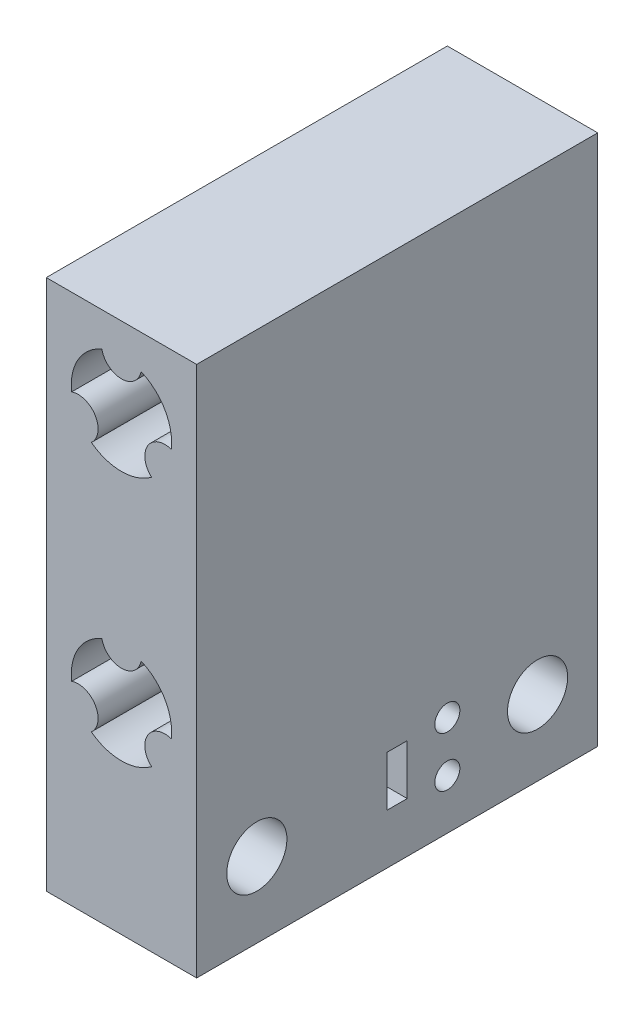
ISO-10303-21;
HEADER;
FILE_DESCRIPTION(('STEP AP214'),'2;1');
FILE_NAME('part.step','',(''),(''),'','','');
FILE_SCHEMA(('AUTOMOTIVE_DESIGN { 1 0 10303 214 1 1 1 1 }'));
ENDSEC;
DATA;
#1=APPLICATION_CONTEXT('core data for automotive mechanical design processes');
#2=APPLICATION_PROTOCOL_DEFINITION('international standard','automotive_design',2000,#1);
#3=PRODUCT_CONTEXT('',#1,'mechanical');
#4=PRODUCT('Part','Part','',(#3));
#5=PRODUCT_RELATED_PRODUCT_CATEGORY('part','',(#4));
#6=PRODUCT_DEFINITION_FORMATION('','',#4);
#7=PRODUCT_DEFINITION_CONTEXT('part definition',#1,'design');
#8=PRODUCT_DEFINITION('design','',#6,#7);
#9=PRODUCT_DEFINITION_SHAPE('','',#8);
#10=(LENGTH_UNIT() NAMED_UNIT(*) SI_UNIT(.MILLI.,.METRE.));
#11=(NAMED_UNIT(*) PLANE_ANGLE_UNIT() SI_UNIT($,.RADIAN.));
#12=(NAMED_UNIT(*) SI_UNIT($,.STERADIAN.) SOLID_ANGLE_UNIT());
#13=UNCERTAINTY_MEASURE_WITH_UNIT(LENGTH_MEASURE(1.E-05),#10,'distance_accuracy_value','');
#14=(GEOMETRIC_REPRESENTATION_CONTEXT(3) GLOBAL_UNCERTAINTY_ASSIGNED_CONTEXT((#13)) GLOBAL_UNIT_ASSIGNED_CONTEXT((#10,
#11,#12)) REPRESENTATION_CONTEXT('',''));
#15=CARTESIAN_POINT('',(0.,0.,0.));
#16=DIRECTION('',(0.,0.,1.));
#17=DIRECTION('',(1.,0.,0.));
#18=AXIS2_PLACEMENT_3D('',#15,#16,#17);
#19=CARTESIAN_POINT('',(9.525,28.575,50.8));
#20=DIRECTION('',(1.,0.,0.));
#21=DIRECTION('',(0.,1.,0.));
#22=AXIS2_PLACEMENT_3D('',#19,#20,#21);
#23=PLANE('',#22);
#24=CARTESIAN_POINT('',(9.525,-34.925,19.05));
#25=DIRECTION('',(1.,0.,0.));
#26=DIRECTION('',(0.,1.,0.));
#27=AXIS2_PLACEMENT_3D('',#24,#25,#26);
#28=CIRCLE('',#27,1.5875);
#29=CARTESIAN_POINT('',(9.525,-33.3375,19.05));
#30=VERTEX_POINT('',#29);
#31=EDGE_CURVE('E670',#30,#30,#28,.T.);
#32=ORIENTED_EDGE('',*,*,#31,.F.);
#33=EDGE_LOOP('',(#32));
#34=FACE_BOUND('',#33,.T.);
#35=CARTESIAN_POINT('',(9.525,-28.575,19.05));
#36=DIRECTION('',(1.,0.,0.));
#37=DIRECTION('',(0.,1.,0.));
#38=AXIS2_PLACEMENT_3D('',#35,#36,#37);
#39=CIRCLE('',#38,1.5875);
#40=CARTESIAN_POINT('',(9.525,-26.9875,19.05));
#41=VERTEX_POINT('',#40);
#42=EDGE_CURVE('E672',#41,#41,#39,.T.);
#43=ORIENTED_EDGE('',*,*,#42,.F.);
#44=EDGE_LOOP('',(#43));
#45=FACE_BOUND('',#44,.T.);
#46=DIRECTION('',(0.,1.,0.));
#47=VECTOR('',#46,1.);
#48=CARTESIAN_POINT('',(9.525,-34.925,24.13));
#49=LINE('',#48,#47);
#50=CARTESIAN_POINT('',(9.525,-34.925,24.13));
#51=VERTEX_POINT('',#50);
#52=CARTESIAN_POINT('',(9.525,-28.575,24.13));
#53=VERTEX_POINT('',#52);
#54=EDGE_CURVE('E68',#51,#53,#49,.T.);
#55=ORIENTED_EDGE('',*,*,#54,.F.);
#56=DIRECTION('',(0.,0.,1.));
#57=VECTOR('',#56,1.);
#58=CARTESIAN_POINT('',(9.525,-34.925,24.13));
#59=LINE('',#58,#57);
#60=CARTESIAN_POINT('',(9.525,-34.925,26.67));
#61=VERTEX_POINT('',#60);
#62=EDGE_CURVE('E242',#51,#61,#59,.T.);
#63=ORIENTED_EDGE('',*,*,#62,.T.);
#64=DIRECTION('',(0.,1.,0.));
#65=VECTOR('',#64,1.);
#66=CARTESIAN_POINT('',(9.525,-34.925,26.67));
#67=LINE('',#66,#65);
#68=CARTESIAN_POINT('',(9.525,-28.575,26.67));
#69=VERTEX_POINT('',#68);
#70=EDGE_CURVE('E246',#61,#69,#67,.T.);
#71=ORIENTED_EDGE('',*,*,#70,.T.);
#72=DIRECTION('',(0.,0.,1.));
#73=VECTOR('',#72,1.);
#74=CARTESIAN_POINT('',(9.525,-28.575,24.13));
#75=LINE('',#74,#73);
#76=EDGE_CURVE('E258',#53,#69,#75,.T.);
#77=ORIENTED_EDGE('',*,*,#76,.F.);
#78=EDGE_LOOP('',(#55,#63,#71,#77));
#79=FACE_BOUND('',#78,.T.);
#80=CARTESIAN_POINT('',(9.525,-31.75,7.62));
#81=DIRECTION('',(1.,0.,0.));
#82=DIRECTION('',(0.,1.,0.));
#83=AXIS2_PLACEMENT_3D('',#80,#81,#82);
#84=CIRCLE('',#83,3.81);
#85=CARTESIAN_POINT('',(9.525,-27.94,7.62));
#86=VERTEX_POINT('',#85);
#87=EDGE_CURVE('E279',#86,#86,#84,.T.);
#88=ORIENTED_EDGE('',*,*,#87,.F.);
#89=EDGE_LOOP('',(#88));
#90=FACE_BOUND('',#89,.T.);
#91=CARTESIAN_POINT('',(9.525,-31.75,43.18));
#92=DIRECTION('',(1.,0.,0.));
#93=DIRECTION('',(0.,1.,0.));
#94=AXIS2_PLACEMENT_3D('',#91,#92,#93);
#95=CIRCLE('',#94,3.81);
#96=CARTESIAN_POINT('',(9.525,-27.94,43.18));
#97=VERTEX_POINT('',#96);
#98=EDGE_CURVE('E283',#97,#97,#95,.T.);
#99=ORIENTED_EDGE('',*,*,#98,.F.);
#100=EDGE_LOOP('',(#99));
#101=FACE_BOUND('',#100,.T.);
#102=DIRECTION('',(0.,-1.,0.));
#103=VECTOR('',#102,1.);
#104=CARTESIAN_POINT('',(9.525,28.575,0.));
#105=LINE('',#104,#103);
#106=CARTESIAN_POINT('',(9.525,26.035,0.));
#107=VERTEX_POINT('',#106);
#108=CARTESIAN_POINT('',(9.52500000000001,-41.275,0.));
#109=VERTEX_POINT('',#108);
#110=EDGE_CURVE('E387',#107,#109,#105,.T.);
#111=ORIENTED_EDGE('',*,*,#110,.F.);
#112=DIRECTION('',(0.,0.,-1.));
#113=VECTOR('',#112,1.);
#114=CARTESIAN_POINT('',(9.525,26.035,0.));
#115=LINE('',#114,#113);
#116=CARTESIAN_POINT('',(9.525,26.035,50.8));
#117=VERTEX_POINT('',#116);
#118=EDGE_CURVE('E311',#117,#107,#115,.T.);
#119=ORIENTED_EDGE('',*,*,#118,.F.);
#120=DIRECTION('',(0.,-1.,0.));
#121=VECTOR('',#120,1.);
#122=CARTESIAN_POINT('',(9.525,28.575,50.8));
#123=LINE('',#122,#121);
#124=CARTESIAN_POINT('',(9.52500000000001,-41.275,50.8));
#125=VERTEX_POINT('',#124);
#126=EDGE_CURVE('E386',#117,#125,#123,.T.);
#127=ORIENTED_EDGE('',*,*,#126,.T.);
#128=DIRECTION('',(0.,0.,1.));
#129=VECTOR('',#128,1.);
#130=CARTESIAN_POINT('',(9.52500000000001,-41.275,50.8));
#131=LINE('',#130,#129);
#132=EDGE_CURVE('E297',#109,#125,#131,.T.);
#133=ORIENTED_EDGE('',*,*,#132,.F.);
#134=EDGE_LOOP('',(#111,#119,#127,#133));
#135=FACE_BOUND('',#134,.T.);
#136=ADVANCED_FACE('F49',(#34,#45,#79,#90,#101,#135),#23,.T.);
#137=CARTESIAN_POINT('',(-9.525,28.575,50.8));
#138=DIRECTION('',(1.,0.,0.));
#139=DIRECTION('',(0.,1.,0.));
#140=AXIS2_PLACEMENT_3D('',#137,#138,#139);
#141=PLANE('',#140);
#142=CARTESIAN_POINT('',(-9.525,-34.925,19.05));
#143=DIRECTION('',(1.,0.,0.));
#144=DIRECTION('',(0.,1.,0.));
#145=AXIS2_PLACEMENT_3D('',#142,#143,#144);
#146=CIRCLE('',#145,1.5875);
#147=CARTESIAN_POINT('',(-9.525,-33.3375,19.05));
#148=VERTEX_POINT('',#147);
#149=EDGE_CURVE('E259',#148,#148,#146,.T.);
#150=ORIENTED_EDGE('',*,*,#149,.T.);
#151=EDGE_LOOP('',(#150));
#152=FACE_BOUND('',#151,.T.);
#153=CARTESIAN_POINT('',(-9.525,-28.575,19.05));
#154=DIRECTION('',(1.,0.,0.));
#155=DIRECTION('',(0.,1.,0.));
#156=AXIS2_PLACEMENT_3D('',#153,#154,#155);
#157=CIRCLE('',#156,1.5875);
#158=CARTESIAN_POINT('',(-9.525,-26.9875,19.05));
#159=VERTEX_POINT('',#158);
#160=EDGE_CURVE('E249',#159,#159,#157,.T.);
#161=ORIENTED_EDGE('',*,*,#160,.T.);
#162=EDGE_LOOP('',(#161));
#163=FACE_BOUND('',#162,.T.);
#164=DIRECTION('',(0.,0.,1.));
#165=VECTOR('',#164,1.);
#166=CARTESIAN_POINT('',(-9.525,-34.925,24.13));
#167=LINE('',#166,#165);
#168=CARTESIAN_POINT('',(-9.525,-34.925,24.13));
#169=VERTEX_POINT('',#168);
#170=CARTESIAN_POINT('',(-9.525,-34.925,26.67));
#171=VERTEX_POINT('',#170);
#172=EDGE_CURVE('E230',#169,#171,#167,.T.);
#173=ORIENTED_EDGE('',*,*,#172,.F.);
#174=DIRECTION('',(0.,1.,0.));
#175=VECTOR('',#174,1.);
#176=CARTESIAN_POINT('',(-9.525,-34.925,24.13));
#177=LINE('',#176,#175);
#178=CARTESIAN_POINT('',(-9.525,-28.575,24.13));
#179=VERTEX_POINT('',#178);
#180=EDGE_CURVE('E226',#169,#179,#177,.T.);
#181=ORIENTED_EDGE('',*,*,#180,.T.);
#182=DIRECTION('',(0.,0.,1.));
#183=VECTOR('',#182,1.);
#184=CARTESIAN_POINT('',(-9.525,-28.575,24.13));
#185=LINE('',#184,#183);
#186=CARTESIAN_POINT('',(-9.525,-28.575,26.67));
#187=VERTEX_POINT('',#186);
#188=EDGE_CURVE('E233',#179,#187,#185,.T.);
#189=ORIENTED_EDGE('',*,*,#188,.T.);
#190=DIRECTION('',(0.,1.,0.));
#191=VECTOR('',#190,1.);
#192=CARTESIAN_POINT('',(-9.525,-34.925,26.67));
#193=LINE('',#192,#191);
#194=EDGE_CURVE('E238',#171,#187,#193,.T.);
#195=ORIENTED_EDGE('',*,*,#194,.F.);
#196=EDGE_LOOP('',(#173,#181,#189,#195));
#197=FACE_BOUND('',#196,.T.);
#198=CARTESIAN_POINT('',(-9.525,-31.75,7.62));
#199=DIRECTION('',(1.,0.,0.));
#200=DIRECTION('',(0.,1.,0.));
#201=AXIS2_PLACEMENT_3D('',#198,#199,#200);
#202=CIRCLE('',#201,3.81);
#203=CARTESIAN_POINT('',(-9.525,-27.94,7.62));
#204=VERTEX_POINT('',#203);
#205=EDGE_CURVE('E274',#204,#204,#202,.T.);
#206=ORIENTED_EDGE('',*,*,#205,.T.);
#207=EDGE_LOOP('',(#206));
#208=FACE_BOUND('',#207,.T.);
#209=CARTESIAN_POINT('',(-9.525,-31.75,43.18));
#210=DIRECTION('',(1.,0.,0.));
#211=DIRECTION('',(0.,1.,0.));
#212=AXIS2_PLACEMENT_3D('',#209,#210,#211);
#213=CIRCLE('',#212,3.81);
#214=CARTESIAN_POINT('',(-9.525,-27.94,43.18));
#215=VERTEX_POINT('',#214);
#216=EDGE_CURVE('E268',#215,#215,#213,.T.);
#217=ORIENTED_EDGE('',*,*,#216,.T.);
#218=EDGE_LOOP('',(#217));
#219=FACE_BOUND('',#218,.T.);
#220=DIRECTION('',(0.,0.,1.));
#221=VECTOR('',#220,1.);
#222=CARTESIAN_POINT('',(-9.525,26.035,0.));
#223=LINE('',#222,#221);
#224=CARTESIAN_POINT('',(-9.525,26.035,0.));
#225=VERTEX_POINT('',#224);
#226=CARTESIAN_POINT('',(-9.525,26.035,50.8));
#227=VERTEX_POINT('',#226);
#228=EDGE_CURVE('E305',#225,#227,#223,.T.);
#229=ORIENTED_EDGE('',*,*,#228,.F.);
#230=DIRECTION('',(0.,-1.,0.));
#231=VECTOR('',#230,1.);
#232=CARTESIAN_POINT('',(-9.525,28.575,0.));
#233=LINE('',#232,#231);
#234=CARTESIAN_POINT('',(-9.525,-41.275,0.));
#235=VERTEX_POINT('',#234);
#236=EDGE_CURVE('E391',#225,#235,#233,.T.);
#237=ORIENTED_EDGE('',*,*,#236,.T.);
#238=DIRECTION('',(0.,0.,-1.));
#239=VECTOR('',#238,1.);
#240=CARTESIAN_POINT('',(-9.525,-41.275,50.8));
#241=LINE('',#240,#239);
#242=CARTESIAN_POINT('',(-9.525,-41.275,50.8));
#243=VERTEX_POINT('',#242);
#244=EDGE_CURVE('E278',#243,#235,#241,.T.);
#245=ORIENTED_EDGE('',*,*,#244,.F.);
#246=DIRECTION('',(0.,-1.,0.));
#247=VECTOR('',#246,1.);
#248=CARTESIAN_POINT('',(-9.525,28.575,50.8));
#249=LINE('',#248,#247);
#250=EDGE_CURVE('E383',#227,#243,#249,.T.);
#251=ORIENTED_EDGE('',*,*,#250,.F.);
#252=EDGE_LOOP('',(#229,#237,#245,#251));
#253=FACE_BOUND('',#252,.T.);
#254=ADVANCED_FACE('F51',(#152,#163,#197,#208,#219,#253),#141,.F.);
#255=CARTESIAN_POINT('',(0.,0.,50.8));
#256=DIRECTION('',(0.,0.,1.));
#257=DIRECTION('',(1.,0.,0.));
#258=AXIS2_PLACEMENT_3D('',#255,#256,#257);
#259=PLANE('',#258);
#260=CARTESIAN_POINT('',(0.,15.875,50.8));
#261=DIRECTION('',(0.,0.,1.));
#262=DIRECTION('',(1.,0.,0.));
#263=AXIS2_PLACEMENT_3D('',#260,#261,#262);
#264=CIRCLE('',#263,6.35);
#265=CARTESIAN_POINT('',(-3.81497961957465,10.7987385309433,50.8));
#266=VERTEX_POINT('',#265);
#267=CARTESIAN_POINT('',(3.81497961957505,10.7987385309436,50.8));
#268=VERTEX_POINT('',#267);
#269=EDGE_CURVE('E343',#266,#268,#264,.T.);
#270=ORIENTED_EDGE('',*,*,#269,.F.);
#271=CARTESIAN_POINT('',(-5.49926131403095,12.6999999999999,50.8));
#272=DIRECTION('',(0.,0.,1.));
#273=DIRECTION('',(1.,0.,0.));
#274=AXIS2_PLACEMENT_3D('',#271,#272,#273);
#275=CIRCLE('',#274,2.54);
#276=CARTESIAN_POINT('',(-6.30366119824253,15.1092614690564,50.8));
#277=VERTEX_POINT('',#276);
#278=EDGE_CURVE('E318',#266,#277,#275,.T.);
#279=ORIENTED_EDGE('',*,*,#278,.T.);
#280=CARTESIAN_POINT('',(-2.48868157866772,21.717,50.8));
#281=VERTEX_POINT('',#280);
#282=EDGE_CURVE('E345',#281,#277,#264,.T.);
#283=ORIENTED_EDGE('',*,*,#282,.F.);
#284=CARTESIAN_POINT('',(0.,22.225,50.8));
#285=DIRECTION('',(0.,0.,1.));
#286=DIRECTION('',(1.,0.,0.));
#287=AXIS2_PLACEMENT_3D('',#284,#285,#286);
#288=CIRCLE('',#287,2.54);
#289=CARTESIAN_POINT('',(2.4886815786677,21.717,50.8));
#290=VERTEX_POINT('',#289);
#291=EDGE_CURVE('E329',#281,#290,#288,.T.);
#292=ORIENTED_EDGE('',*,*,#291,.T.);
#293=CARTESIAN_POINT('',(6.30366119824256,15.1092614690568,50.8));
#294=VERTEX_POINT('',#293);
#295=EDGE_CURVE('E339',#294,#290,#264,.T.);
#296=ORIENTED_EDGE('',*,*,#295,.F.);
#297=CARTESIAN_POINT('',(5.49926131403144,12.7000000000001,50.8));
#298=DIRECTION('',(0.,0.,1.));
#299=DIRECTION('',(1.,0.,0.));
#300=AXIS2_PLACEMENT_3D('',#297,#298,#299);
#301=CIRCLE('',#300,2.54);
#302=EDGE_CURVE('E317',#294,#268,#301,.T.);
#303=ORIENTED_EDGE('',*,*,#302,.T.);
#304=EDGE_LOOP('',(#270,#279,#283,#292,#296,#303));
#305=FACE_BOUND('',#304,.T.);
#306=CARTESIAN_POINT('',(0.,-15.875,50.8));
#307=DIRECTION('',(0.,0.,1.));
#308=DIRECTION('',(1.,0.,0.));
#309=AXIS2_PLACEMENT_3D('',#306,#307,#308);
#310=CIRCLE('',#309,6.35);
#311=CARTESIAN_POINT('',(-2.48868157866771,-10.033,50.8));
#312=VERTEX_POINT('',#311);
#313=CARTESIAN_POINT('',(-6.30366119824252,-16.6407385309436,50.8));
#314=VERTEX_POINT('',#313);
#315=EDGE_CURVE('E378',#312,#314,#310,.T.);
#316=ORIENTED_EDGE('',*,*,#315,.F.);
#317=CARTESIAN_POINT('',(0.,-9.525,50.8));
#318=DIRECTION('',(0.,0.,1.));
#319=DIRECTION('',(1.,0.,0.));
#320=AXIS2_PLACEMENT_3D('',#317,#318,#319);
#321=CIRCLE('',#320,2.54);
#322=CARTESIAN_POINT('',(2.48868157866771,-10.033,50.8));
#323=VERTEX_POINT('',#322);
#324=EDGE_CURVE('E350',#312,#323,#321,.T.);
#325=ORIENTED_EDGE('',*,*,#324,.T.);
#326=CARTESIAN_POINT('',(6.30366119824257,-16.6407385309432,50.8));
#327=VERTEX_POINT('',#326);
#328=EDGE_CURVE('E372',#327,#323,#310,.T.);
#329=ORIENTED_EDGE('',*,*,#328,.F.);
#330=CARTESIAN_POINT('',(5.49926131403144,-19.0499999999999,50.8));
#331=DIRECTION('',(0.,0.,1.));
#332=DIRECTION('',(1.,0.,0.));
#333=AXIS2_PLACEMENT_3D('',#330,#331,#332);
#334=CIRCLE('',#333,2.54);
#335=CARTESIAN_POINT('',(3.81497961957505,-20.9512614690564,50.8));
#336=VERTEX_POINT('',#335);
#337=EDGE_CURVE('E368',#327,#336,#334,.T.);
#338=ORIENTED_EDGE('',*,*,#337,.T.);
#339=CARTESIAN_POINT('',(-3.81497961957464,-20.9512614690567,50.8));
#340=VERTEX_POINT('',#339);
#341=EDGE_CURVE('E376',#340,#336,#310,.T.);
#342=ORIENTED_EDGE('',*,*,#341,.F.);
#343=CARTESIAN_POINT('',(-5.49926131403094,-19.0500000000001,50.8));
#344=DIRECTION('',(0.,0.,1.));
#345=DIRECTION('',(1.,0.,0.));
#346=AXIS2_PLACEMENT_3D('',#343,#344,#345);
#347=CIRCLE('',#346,2.54);
#348=EDGE_CURVE('E361',#340,#314,#347,.T.);
#349=ORIENTED_EDGE('',*,*,#348,.T.);
#350=EDGE_LOOP('',(#316,#325,#329,#338,#342,#349));
#351=FACE_BOUND('',#350,.T.);
#352=ORIENTED_EDGE('',*,*,#126,.F.);
#353=DIRECTION('',(1.,0.,0.));
#354=VECTOR('',#353,1.);
#355=CARTESIAN_POINT('',(-9.525,26.035,50.8));
#356=LINE('',#355,#354);
#357=EDGE_CURVE('E308',#227,#117,#356,.T.);
#358=ORIENTED_EDGE('',*,*,#357,.F.);
#359=ORIENTED_EDGE('',*,*,#250,.T.);
#360=DIRECTION('',(-1.,0.,0.));
#361=VECTOR('',#360,1.);
#362=CARTESIAN_POINT('',(-9.525,-41.275,50.8));
#363=LINE('',#362,#361);
#364=EDGE_CURVE('E301',#125,#243,#363,.T.);
#365=ORIENTED_EDGE('',*,*,#364,.F.);
#366=EDGE_LOOP('',(#352,#358,#359,#365));
#367=FACE_BOUND('',#366,.T.);
#368=ADVANCED_FACE('F445',(#305,#351,#367),#259,.T.);
#369=CARTESIAN_POINT('',(0.,0.,0.));
#370=DIRECTION('',(0.,0.,1.));
#371=DIRECTION('',(1.,0.,0.));
#372=AXIS2_PLACEMENT_3D('',#369,#370,#371);
#373=PLANE('',#372);
#374=CARTESIAN_POINT('',(0.,-15.875,0.));
#375=DIRECTION('',(0.,0.,1.));
#376=DIRECTION('',(1.,0.,0.));
#377=AXIS2_PLACEMENT_3D('',#374,#375,#376);
#378=CIRCLE('',#377,6.35);
#379=CARTESIAN_POINT('',(6.30366119824257,-16.6407385309432,0.));
#380=VERTEX_POINT('',#379);
#381=CARTESIAN_POINT('',(2.48868157866771,-10.033,0.));
#382=VERTEX_POINT('',#381);
#383=EDGE_CURVE('E354',#380,#382,#378,.T.);
#384=ORIENTED_EDGE('',*,*,#383,.T.);
#385=CARTESIAN_POINT('',(0.,-9.525,0.));
#386=DIRECTION('',(0.,0.,1.));
#387=DIRECTION('',(1.,0.,0.));
#388=AXIS2_PLACEMENT_3D('',#385,#386,#387);
#389=CIRCLE('',#388,2.54);
#390=CARTESIAN_POINT('',(-2.48868157866771,-10.033,0.));
#391=VERTEX_POINT('',#390);
#392=EDGE_CURVE('E355',#391,#382,#389,.T.);
#393=ORIENTED_EDGE('',*,*,#392,.F.);
#394=CARTESIAN_POINT('',(-6.30366119824252,-16.6407385309436,0.));
#395=VERTEX_POINT('',#394);
#396=EDGE_CURVE('E377',#391,#395,#378,.T.);
#397=ORIENTED_EDGE('',*,*,#396,.T.);
#398=CARTESIAN_POINT('',(-5.49926131403094,-19.0500000000001,0.));
#399=DIRECTION('',(0.,0.,1.));
#400=DIRECTION('',(1.,0.,0.));
#401=AXIS2_PLACEMENT_3D('',#398,#399,#400);
#402=CIRCLE('',#401,2.54);
#403=CARTESIAN_POINT('',(-3.81497961957464,-20.9512614690567,0.));
#404=VERTEX_POINT('',#403);
#405=EDGE_CURVE('E358',#404,#395,#402,.T.);
#406=ORIENTED_EDGE('',*,*,#405,.F.);
#407=CARTESIAN_POINT('',(3.81497961957505,-20.9512614690564,0.));
#408=VERTEX_POINT('',#407);
#409=EDGE_CURVE('E382',#404,#408,#378,.T.);
#410=ORIENTED_EDGE('',*,*,#409,.T.);
#411=CARTESIAN_POINT('',(5.49926131403144,-19.0499999999999,0.));
#412=DIRECTION('',(0.,0.,1.));
#413=DIRECTION('',(1.,0.,0.));
#414=AXIS2_PLACEMENT_3D('',#411,#412,#413);
#415=CIRCLE('',#414,2.54);
#416=EDGE_CURVE('E365',#380,#408,#415,.T.);
#417=ORIENTED_EDGE('',*,*,#416,.F.);
#418=EDGE_LOOP('',(#384,#393,#397,#406,#410,#417));
#419=FACE_BOUND('',#418,.T.);
#420=CARTESIAN_POINT('',(0.,15.875,0.));
#421=DIRECTION('',(0.,0.,1.));
#422=DIRECTION('',(1.,0.,0.));
#423=AXIS2_PLACEMENT_3D('',#420,#421,#422);
#424=CIRCLE('',#423,6.35);
#425=CARTESIAN_POINT('',(-2.48868157866772,21.717,0.));
#426=VERTEX_POINT('',#425);
#427=CARTESIAN_POINT('',(-6.30366119824253,15.1092614690564,0.));
#428=VERTEX_POINT('',#427);
#429=EDGE_CURVE('E344',#426,#428,#424,.T.);
#430=ORIENTED_EDGE('',*,*,#429,.T.);
#431=CARTESIAN_POINT('',(-5.49926131403095,12.6999999999999,0.));
#432=DIRECTION('',(0.,0.,1.));
#433=DIRECTION('',(1.,0.,0.));
#434=AXIS2_PLACEMENT_3D('',#431,#432,#433);
#435=CIRCLE('',#434,2.54);
#436=CARTESIAN_POINT('',(-3.81497961957465,10.7987385309433,0.));
#437=VERTEX_POINT('',#436);
#438=EDGE_CURVE('E323',#437,#428,#435,.T.);
#439=ORIENTED_EDGE('',*,*,#438,.F.);
#440=CARTESIAN_POINT('',(3.81497961957505,10.7987385309436,0.));
#441=VERTEX_POINT('',#440);
#442=EDGE_CURVE('E349',#437,#441,#424,.T.);
#443=ORIENTED_EDGE('',*,*,#442,.T.);
#444=CARTESIAN_POINT('',(5.49926131403144,12.7000000000001,0.));
#445=DIRECTION('',(0.,0.,1.));
#446=DIRECTION('',(1.,0.,0.));
#447=AXIS2_PLACEMENT_3D('',#444,#445,#446);
#448=CIRCLE('',#447,2.54);
#449=CARTESIAN_POINT('',(6.30366119824256,15.1092614690568,0.));
#450=VERTEX_POINT('',#449);
#451=EDGE_CURVE('E333',#450,#441,#448,.T.);
#452=ORIENTED_EDGE('',*,*,#451,.F.);
#453=CARTESIAN_POINT('',(2.4886815786677,21.717,0.));
#454=VERTEX_POINT('',#453);
#455=EDGE_CURVE('E322',#450,#454,#424,.T.);
#456=ORIENTED_EDGE('',*,*,#455,.T.);
#457=CARTESIAN_POINT('',(0.,22.225,0.));
#458=DIRECTION('',(0.,0.,1.));
#459=DIRECTION('',(1.,0.,0.));
#460=AXIS2_PLACEMENT_3D('',#457,#458,#459);
#461=CIRCLE('',#460,2.54);
#462=EDGE_CURVE('E326',#426,#454,#461,.T.);
#463=ORIENTED_EDGE('',*,*,#462,.F.);
#464=EDGE_LOOP('',(#430,#439,#443,#452,#456,#463));
#465=FACE_BOUND('',#464,.T.);
#466=DIRECTION('',(-1.,0.,0.));
#467=VECTOR('',#466,1.);
#468=CARTESIAN_POINT('',(-9.525,26.035,0.));
#469=LINE('',#468,#467);
#470=EDGE_CURVE('E314',#107,#225,#469,.T.);
#471=ORIENTED_EDGE('',*,*,#470,.F.);
#472=ORIENTED_EDGE('',*,*,#110,.T.);
#473=DIRECTION('',(1.,0.,0.));
#474=VECTOR('',#473,1.);
#475=CARTESIAN_POINT('',(-9.525,-41.275,0.));
#476=LINE('',#475,#474);
#477=EDGE_CURVE('E293',#235,#109,#476,.T.);
#478=ORIENTED_EDGE('',*,*,#477,.F.);
#479=ORIENTED_EDGE('',*,*,#236,.F.);
#480=EDGE_LOOP('',(#471,#472,#478,#479));
#481=FACE_BOUND('',#480,.T.);
#482=ADVANCED_FACE('F465',(#419,#465,#481),#373,.F.);
#483=CARTESIAN_POINT('',(0.,15.875,50.8));
#484=DIRECTION('',(0.,0.,-1.));
#485=DIRECTION('',(-1.,0.,0.));
#486=AXIS2_PLACEMENT_3D('',#483,#484,#485);
#487=CYLINDRICAL_SURFACE('',#486,6.35);
#488=ORIENTED_EDGE('',*,*,#282,.T.);
#489=DIRECTION('',(0.,0.,-1.));
#490=VECTOR('',#489,1.);
#491=CARTESIAN_POINT('',(-6.30366119824253,15.1092614690564,25.4));
#492=LINE('',#491,#490);
#493=EDGE_CURVE('E11',#277,#428,#492,.T.);
#494=ORIENTED_EDGE('',*,*,#493,.T.);
#495=ORIENTED_EDGE('',*,*,#429,.F.);
#496=DIRECTION('',(0.,0.,-1.));
#497=VECTOR('',#496,1.);
#498=CARTESIAN_POINT('',(-2.48868157866772,21.717,25.4));
#499=LINE('',#498,#497);
#500=EDGE_CURVE('E427',#426,#281,#499,.F.);
#501=ORIENTED_EDGE('',*,*,#500,.T.);
#502=EDGE_LOOP('',(#488,#494,#495,#501));
#503=FACE_BOUND('',#502,.T.);
#504=ADVANCED_FACE('F453',(#503),#487,.F.);
#505=ORIENTED_EDGE('',*,*,#442,.F.);
#506=DIRECTION('',(0.,0.,-1.));
#507=VECTOR('',#506,1.);
#508=CARTESIAN_POINT('',(-3.81497961957465,10.7987385309433,25.4));
#509=LINE('',#508,#507);
#510=EDGE_CURVE('E58',#437,#266,#509,.F.);
#511=ORIENTED_EDGE('',*,*,#510,.T.);
#512=ORIENTED_EDGE('',*,*,#269,.T.);
#513=DIRECTION('',(0.,0.,-1.));
#514=VECTOR('',#513,1.);
#515=CARTESIAN_POINT('',(3.81497961957505,10.7987385309436,25.4));
#516=LINE('',#515,#514);
#517=EDGE_CURVE('E423',#268,#441,#516,.T.);
#518=ORIENTED_EDGE('',*,*,#517,.T.);
#519=EDGE_LOOP('',(#505,#511,#512,#518));
#520=FACE_BOUND('',#519,.T.);
#521=ADVANCED_FACE('F441',(#520),#487,.F.);
#522=ORIENTED_EDGE('',*,*,#295,.T.);
#523=DIRECTION('',(0.,0.,-1.));
#524=VECTOR('',#523,1.);
#525=CARTESIAN_POINT('',(2.4886815786677,21.717,25.4));
#526=LINE('',#525,#524);
#527=EDGE_CURVE('E431',#290,#454,#526,.T.);
#528=ORIENTED_EDGE('',*,*,#527,.T.);
#529=ORIENTED_EDGE('',*,*,#455,.F.);
#530=DIRECTION('',(0.,0.,-1.));
#531=VECTOR('',#530,1.);
#532=CARTESIAN_POINT('',(6.30366119824256,15.1092614690568,25.4));
#533=LINE('',#532,#531);
#534=EDGE_CURVE('E419',#450,#294,#533,.F.);
#535=ORIENTED_EDGE('',*,*,#534,.T.);
#536=EDGE_LOOP('',(#522,#528,#529,#535));
#537=FACE_BOUND('',#536,.T.);
#538=ADVANCED_FACE('F459',(#537),#487,.F.);
#539=CARTESIAN_POINT('',(0.,-15.875,50.8));
#540=DIRECTION('',(0.,0.,-1.));
#541=DIRECTION('',(-1.,0.,0.));
#542=AXIS2_PLACEMENT_3D('',#539,#540,#541);
#543=CYLINDRICAL_SURFACE('',#542,6.35);
#544=ORIENTED_EDGE('',*,*,#328,.T.);
#545=DIRECTION('',(0.,0.,-1.));
#546=VECTOR('',#545,1.);
#547=CARTESIAN_POINT('',(2.48868157866771,-10.033,25.4));
#548=LINE('',#547,#546);
#549=EDGE_CURVE('E415',#323,#382,#548,.T.);
#550=ORIENTED_EDGE('',*,*,#549,.T.);
#551=ORIENTED_EDGE('',*,*,#383,.F.);
#552=DIRECTION('',(0.,0.,-1.));
#553=VECTOR('',#552,1.);
#554=CARTESIAN_POINT('',(6.30366119824257,-16.6407385309432,25.4));
#555=LINE('',#554,#553);
#556=EDGE_CURVE('E390',#380,#327,#555,.F.);
#557=ORIENTED_EDGE('',*,*,#556,.T.);
#558=EDGE_LOOP('',(#544,#550,#551,#557));
#559=FACE_BOUND('',#558,.T.);
#560=ADVANCED_FACE('F494',(#559),#543,.F.);
#561=ORIENTED_EDGE('',*,*,#396,.F.);
#562=DIRECTION('',(0.,0.,-1.));
#563=VECTOR('',#562,1.);
#564=CARTESIAN_POINT('',(-2.48868157866771,-10.033,25.4));
#565=LINE('',#564,#563);
#566=EDGE_CURVE('E411',#391,#312,#565,.F.);
#567=ORIENTED_EDGE('',*,*,#566,.T.);
#568=ORIENTED_EDGE('',*,*,#315,.T.);
#569=DIRECTION('',(0.,0.,-1.));
#570=VECTOR('',#569,1.);
#571=CARTESIAN_POINT('',(-6.30366119824252,-16.6407385309436,25.4));
#572=LINE('',#571,#570);
#573=EDGE_CURVE('E407',#314,#395,#572,.T.);
#574=ORIENTED_EDGE('',*,*,#573,.T.);
#575=EDGE_LOOP('',(#561,#567,#568,#574));
#576=FACE_BOUND('',#575,.T.);
#577=ADVANCED_FACE('F497',(#576),#543,.F.);
#578=ORIENTED_EDGE('',*,*,#409,.F.);
#579=DIRECTION('',(0.,0.,-1.));
#580=VECTOR('',#579,1.);
#581=CARTESIAN_POINT('',(-3.81497961957464,-20.9512614690567,25.4));
#582=LINE('',#581,#580);
#583=EDGE_CURVE('E403',#404,#340,#582,.F.);
#584=ORIENTED_EDGE('',*,*,#583,.T.);
#585=ORIENTED_EDGE('',*,*,#341,.T.);
#586=DIRECTION('',(0.,0.,-1.));
#587=VECTOR('',#586,1.);
#588=CARTESIAN_POINT('',(3.81497961957505,-20.9512614690564,25.4));
#589=LINE('',#588,#587);
#590=EDGE_CURVE('E399',#336,#408,#589,.T.);
#591=ORIENTED_EDGE('',*,*,#590,.T.);
#592=EDGE_LOOP('',(#578,#584,#585,#591));
#593=FACE_BOUND('',#592,.T.);
#594=ADVANCED_FACE('F499',(#593),#543,.F.);
#595=CARTESIAN_POINT('',(5.49926131403144,-19.0499999999999,50.8));
#596=DIRECTION('',(0.,0.,-1.));
#597=DIRECTION('',(-1.,0.,0.));
#598=AXIS2_PLACEMENT_3D('',#595,#596,#597);
#599=CYLINDRICAL_SURFACE('',#598,2.54);
#600=ORIENTED_EDGE('',*,*,#590,.F.);
#601=ORIENTED_EDGE('',*,*,#337,.F.);
#602=ORIENTED_EDGE('',*,*,#556,.F.);
#603=ORIENTED_EDGE('',*,*,#416,.T.);
#604=EDGE_LOOP('',(#600,#601,#602,#603));
#605=FACE_BOUND('',#604,.T.);
#606=ADVANCED_FACE('F500',(#605),#599,.T.);
#607=CARTESIAN_POINT('',(-5.49926131403094,-19.0500000000001,50.8));
#608=DIRECTION('',(0.,0.,-1.));
#609=DIRECTION('',(-1.,0.,0.));
#610=AXIS2_PLACEMENT_3D('',#607,#608,#609);
#611=CYLINDRICAL_SURFACE('',#610,2.54);
#612=ORIENTED_EDGE('',*,*,#573,.F.);
#613=ORIENTED_EDGE('',*,*,#348,.F.);
#614=ORIENTED_EDGE('',*,*,#583,.F.);
#615=ORIENTED_EDGE('',*,*,#405,.T.);
#616=EDGE_LOOP('',(#612,#613,#614,#615));
#617=FACE_BOUND('',#616,.T.);
#618=ADVANCED_FACE('F503',(#617),#611,.T.);
#619=CARTESIAN_POINT('',(0.,-9.525,50.8));
#620=DIRECTION('',(0.,0.,-1.));
#621=DIRECTION('',(-1.,0.,0.));
#622=AXIS2_PLACEMENT_3D('',#619,#620,#621);
#623=CYLINDRICAL_SURFACE('',#622,2.54);
#624=ORIENTED_EDGE('',*,*,#549,.F.);
#625=ORIENTED_EDGE('',*,*,#324,.F.);
#626=ORIENTED_EDGE('',*,*,#566,.F.);
#627=ORIENTED_EDGE('',*,*,#392,.T.);
#628=EDGE_LOOP('',(#624,#625,#626,#627));
#629=FACE_BOUND('',#628,.T.);
#630=ADVANCED_FACE('F479',(#629),#623,.T.);
#631=CARTESIAN_POINT('',(5.49926131403144,12.7000000000001,50.8));
#632=DIRECTION('',(0.,0.,-1.));
#633=DIRECTION('',(-1.,0.,0.));
#634=AXIS2_PLACEMENT_3D('',#631,#632,#633);
#635=CYLINDRICAL_SURFACE('',#634,2.54);
#636=ORIENTED_EDGE('',*,*,#517,.F.);
#637=ORIENTED_EDGE('',*,*,#302,.F.);
#638=ORIENTED_EDGE('',*,*,#534,.F.);
#639=ORIENTED_EDGE('',*,*,#451,.T.);
#640=EDGE_LOOP('',(#636,#637,#638,#639));
#641=FACE_BOUND('',#640,.T.);
#642=ADVANCED_FACE('F463',(#641),#635,.T.);
#643=CARTESIAN_POINT('',(0.,22.225,50.8));
#644=DIRECTION('',(0.,0.,-1.));
#645=DIRECTION('',(-1.,0.,0.));
#646=AXIS2_PLACEMENT_3D('',#643,#644,#645);
#647=CYLINDRICAL_SURFACE('',#646,2.54);
#648=ORIENTED_EDGE('',*,*,#527,.F.);
#649=ORIENTED_EDGE('',*,*,#291,.F.);
#650=ORIENTED_EDGE('',*,*,#500,.F.);
#651=ORIENTED_EDGE('',*,*,#462,.T.);
#652=EDGE_LOOP('',(#648,#649,#650,#651));
#653=FACE_BOUND('',#652,.T.);
#654=ADVANCED_FACE('F469',(#653),#647,.T.);
#655=CARTESIAN_POINT('',(-5.49926131403095,12.6999999999999,50.8));
#656=DIRECTION('',(0.,0.,-1.));
#657=DIRECTION('',(-1.,0.,0.));
#658=AXIS2_PLACEMENT_3D('',#655,#656,#657);
#659=CYLINDRICAL_SURFACE('',#658,2.54);
#660=ORIENTED_EDGE('',*,*,#493,.F.);
#661=ORIENTED_EDGE('',*,*,#278,.F.);
#662=ORIENTED_EDGE('',*,*,#510,.F.);
#663=ORIENTED_EDGE('',*,*,#438,.T.);
#664=EDGE_LOOP('',(#660,#661,#662,#663));
#665=FACE_BOUND('',#664,.T.);
#666=ADVANCED_FACE('F471',(#665),#659,.T.);
#667=CARTESIAN_POINT('',(0.,26.035,0.));
#668=DIRECTION('',(0.,1.,0.));
#669=DIRECTION('',(-1.,0.,0.));
#670=AXIS2_PLACEMENT_3D('',#667,#668,#669);
#671=PLANE('',#670);
#672=ORIENTED_EDGE('',*,*,#228,.T.);
#673=ORIENTED_EDGE('',*,*,#357,.T.);
#674=ORIENTED_EDGE('',*,*,#118,.T.);
#675=ORIENTED_EDGE('',*,*,#470,.T.);
#676=EDGE_LOOP('',(#672,#673,#674,#675));
#677=FACE_BOUND('',#676,.T.);
#678=ADVANCED_FACE('F476',(#677),#671,.T.);
#679=CARTESIAN_POINT('',(0.,-41.275,0.));
#680=DIRECTION('',(0.,-1.,0.));
#681=DIRECTION('',(1.,0.,0.));
#682=AXIS2_PLACEMENT_3D('',#679,#680,#681);
#683=PLANE('',#682);
#684=ORIENTED_EDGE('',*,*,#244,.T.);
#685=ORIENTED_EDGE('',*,*,#477,.T.);
#686=ORIENTED_EDGE('',*,*,#132,.T.);
#687=ORIENTED_EDGE('',*,*,#364,.T.);
#688=EDGE_LOOP('',(#684,#685,#686,#687));
#689=FACE_BOUND('',#688,.T.);
#690=ADVANCED_FACE('F530',(#689),#683,.T.);
#691=CARTESIAN_POINT('',(-9.525,-31.75,43.18));
#692=DIRECTION('',(1.,0.,0.));
#693=DIRECTION('',(0.,1.,0.));
#694=AXIS2_PLACEMENT_3D('',#691,#692,#693);
#695=CYLINDRICAL_SURFACE('',#694,3.81);
#696=ORIENTED_EDGE('',*,*,#216,.F.);
#697=EDGE_LOOP('',(#696));
#698=FACE_BOUND('',#697,.T.);
#699=ORIENTED_EDGE('',*,*,#98,.T.);
#700=EDGE_LOOP('',(#699));
#701=FACE_BOUND('',#700,.T.);
#702=ADVANCED_FACE('F592',(#698,#701),#695,.F.);
#703=CARTESIAN_POINT('',(-9.525,-31.75,7.62));
#704=DIRECTION('',(1.,0.,0.));
#705=DIRECTION('',(0.,1.,0.));
#706=AXIS2_PLACEMENT_3D('',#703,#704,#705);
#707=CYLINDRICAL_SURFACE('',#706,3.81);
#708=ORIENTED_EDGE('',*,*,#205,.F.);
#709=EDGE_LOOP('',(#708));
#710=FACE_BOUND('',#709,.T.);
#711=ORIENTED_EDGE('',*,*,#87,.T.);
#712=EDGE_LOOP('',(#711));
#713=FACE_BOUND('',#712,.T.);
#714=ADVANCED_FACE('F604',(#710,#713),#707,.F.);
#715=CARTESIAN_POINT('',(-9.525,-34.925,24.13));
#716=DIRECTION('',(0.,0.,-1.));
#717=DIRECTION('',(-1.,0.,0.));
#718=AXIS2_PLACEMENT_3D('',#715,#716,#717);
#719=PLANE('',#718);
#720=ORIENTED_EDGE('',*,*,#54,.T.);
#721=DIRECTION('',(1.,0.,0.));
#722=VECTOR('',#721,1.);
#723=CARTESIAN_POINT('',(-9.525,-28.575,24.13));
#724=LINE('',#723,#722);
#725=EDGE_CURVE('E223',#179,#53,#724,.T.);
#726=ORIENTED_EDGE('',*,*,#725,.F.);
#727=ORIENTED_EDGE('',*,*,#180,.F.);
#728=DIRECTION('',(1.,0.,0.));
#729=VECTOR('',#728,1.);
#730=CARTESIAN_POINT('',(-9.525,-34.925,24.13));
#731=LINE('',#730,#729);
#732=EDGE_CURVE('E265',#169,#51,#731,.T.);
#733=ORIENTED_EDGE('',*,*,#732,.T.);
#734=EDGE_LOOP('',(#720,#726,#727,#733));
#735=FACE_BOUND('',#734,.T.);
#736=ADVANCED_FACE('F224',(#735),#719,.F.);
#737=CARTESIAN_POINT('',(-9.525,-34.925,24.13));
#738=DIRECTION('',(0.,1.,0.));
#739=DIRECTION('',(-1.,0.,0.));
#740=AXIS2_PLACEMENT_3D('',#737,#738,#739);
#741=PLANE('',#740);
#742=ORIENTED_EDGE('',*,*,#62,.F.);
#743=ORIENTED_EDGE('',*,*,#732,.F.);
#744=ORIENTED_EDGE('',*,*,#172,.T.);
#745=DIRECTION('',(1.,0.,0.));
#746=VECTOR('',#745,1.);
#747=CARTESIAN_POINT('',(-9.525,-34.925,26.67));
#748=LINE('',#747,#746);
#749=EDGE_CURVE('E269',#171,#61,#748,.T.);
#750=ORIENTED_EDGE('',*,*,#749,.T.);
#751=EDGE_LOOP('',(#742,#743,#744,#750));
#752=FACE_BOUND('',#751,.T.);
#753=ADVANCED_FACE('F622',(#752),#741,.T.);
#754=CARTESIAN_POINT('',(-9.525,-34.925,26.67));
#755=DIRECTION('',(0.,0.,-1.));
#756=DIRECTION('',(-1.,0.,0.));
#757=AXIS2_PLACEMENT_3D('',#754,#755,#756);
#758=PLANE('',#757);
#759=ORIENTED_EDGE('',*,*,#70,.F.);
#760=ORIENTED_EDGE('',*,*,#749,.F.);
#761=ORIENTED_EDGE('',*,*,#194,.T.);
#762=DIRECTION('',(1.,0.,0.));
#763=VECTOR('',#762,1.);
#764=CARTESIAN_POINT('',(-9.525,-28.575,26.67));
#765=LINE('',#764,#763);
#766=EDGE_CURVE('E77',#187,#69,#765,.T.);
#767=ORIENTED_EDGE('',*,*,#766,.T.);
#768=EDGE_LOOP('',(#759,#760,#761,#767));
#769=FACE_BOUND('',#768,.T.);
#770=ADVANCED_FACE('F523',(#769),#758,.T.);
#771=CARTESIAN_POINT('',(-9.525,-28.575,24.13));
#772=DIRECTION('',(0.,1.,0.));
#773=DIRECTION('',(-1.,0.,0.));
#774=AXIS2_PLACEMENT_3D('',#771,#772,#773);
#775=PLANE('',#774);
#776=ORIENTED_EDGE('',*,*,#76,.T.);
#777=ORIENTED_EDGE('',*,*,#766,.F.);
#778=ORIENTED_EDGE('',*,*,#188,.F.);
#779=ORIENTED_EDGE('',*,*,#725,.T.);
#780=EDGE_LOOP('',(#776,#777,#778,#779));
#781=FACE_BOUND('',#780,.T.);
#782=ADVANCED_FACE('F234',(#781),#775,.F.);
#783=CARTESIAN_POINT('',(-9.525,-28.575,19.05));
#784=DIRECTION('',(1.,0.,0.));
#785=DIRECTION('',(0.,1.,0.));
#786=AXIS2_PLACEMENT_3D('',#783,#784,#785);
#787=CYLINDRICAL_SURFACE('',#786,1.5875);
#788=ORIENTED_EDGE('',*,*,#160,.F.);
#789=EDGE_LOOP('',(#788));
#790=FACE_BOUND('',#789,.T.);
#791=ORIENTED_EDGE('',*,*,#42,.T.);
#792=EDGE_LOOP('',(#791));
#793=FACE_BOUND('',#792,.T.);
#794=ADVANCED_FACE('F522',(#790,#793),#787,.F.);
#795=CARTESIAN_POINT('',(-9.525,-34.925,19.05));
#796=DIRECTION('',(1.,0.,0.));
#797=DIRECTION('',(0.,1.,0.));
#798=AXIS2_PLACEMENT_3D('',#795,#796,#797);
#799=CYLINDRICAL_SURFACE('',#798,1.5875);
#800=ORIENTED_EDGE('',*,*,#149,.F.);
#801=EDGE_LOOP('',(#800));
#802=FACE_BOUND('',#801,.T.);
#803=ORIENTED_EDGE('',*,*,#31,.T.);
#804=EDGE_LOOP('',(#803));
#805=FACE_BOUND('',#804,.T.);
#806=ADVANCED_FACE('F652',(#802,#805),#799,.F.);
#807=CLOSED_SHELL('',(#136,#254,#368,#482,#504,#521,#538,#560,#577,#594,#606,#618,#630,#642,
#654,#666,#678,#690,#702,#714,#736,#753,#770,#782,#794,#806));
#808=MANIFOLD_SOLID_BREP('B2',#807);
#809=ADVANCED_BREP_SHAPE_REPRESENTATION('',(#18,#808),#14);
#810=SHAPE_DEFINITION_REPRESENTATION(#9,#809);
ENDSEC;
END-ISO-10303-21;
